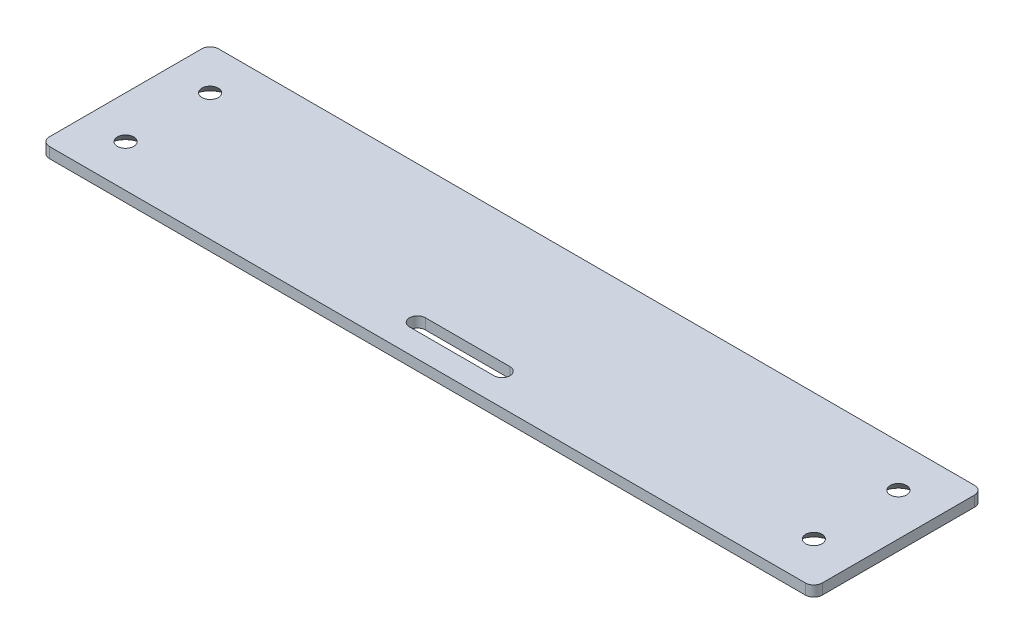
ISO-10303-21;
HEADER;
FILE_DESCRIPTION(('STEP AP214'),'2;1');
FILE_NAME('part.step','',(''),(''),'','','');
FILE_SCHEMA(('AUTOMOTIVE_DESIGN { 1 0 10303 214 1 1 1 1 }'));
ENDSEC;
DATA;
#1=APPLICATION_CONTEXT('core data for automotive mechanical design processes');
#2=APPLICATION_PROTOCOL_DEFINITION('international standard','automotive_design',2000,#1);
#3=PRODUCT_CONTEXT('',#1,'mechanical');
#4=PRODUCT('Part','Part','',(#3));
#5=PRODUCT_RELATED_PRODUCT_CATEGORY('part','',(#4));
#6=PRODUCT_DEFINITION_FORMATION('','',#4);
#7=PRODUCT_DEFINITION_CONTEXT('part definition',#1,'design');
#8=PRODUCT_DEFINITION('design','',#6,#7);
#9=PRODUCT_DEFINITION_SHAPE('','',#8);
#10=(LENGTH_UNIT() NAMED_UNIT(*) SI_UNIT(.MILLI.,.METRE.));
#11=(NAMED_UNIT(*) PLANE_ANGLE_UNIT() SI_UNIT($,.RADIAN.));
#12=(NAMED_UNIT(*) SI_UNIT($,.STERADIAN.) SOLID_ANGLE_UNIT());
#13=UNCERTAINTY_MEASURE_WITH_UNIT(LENGTH_MEASURE(1.E-05),#10,'distance_accuracy_value','');
#14=(GEOMETRIC_REPRESENTATION_CONTEXT(3) GLOBAL_UNCERTAINTY_ASSIGNED_CONTEXT((#13)) GLOBAL_UNIT_ASSIGNED_CONTEXT((#10,
#11,#12)) REPRESENTATION_CONTEXT('',''));
#15=CARTESIAN_POINT('',(0.,0.,0.));
#16=DIRECTION('',(0.,0.,1.));
#17=DIRECTION('',(1.,0.,0.));
#18=AXIS2_PLACEMENT_3D('',#15,#16,#17);
#19=CARTESIAN_POINT('',(-192.225528742822,0.,173.764846249872));
#20=DIRECTION('',(0.,1.,0.));
#21=DIRECTION('',(0.,0.,1.));
#22=AXIS2_PLACEMENT_3D('',#19,#20,#21);
#23=PLANE('',#22);
#24=DIRECTION('',(1.,0.,0.));
#25=VECTOR('',#24,1.);
#26=CARTESIAN_POINT('',(-91.2221287493033,0.,164.392246249872));
#27=LINE('',#26,#25);
#28=CARTESIAN_POINT('',(-91.2221287493033,0.,164.392246249872));
#29=VERTEX_POINT('',#28);
#30=CARTESIAN_POINT('',(-65.8221287493033,0.,164.392246249872));
#31=VERTEX_POINT('',#30);
#32=EDGE_CURVE('E169',#29,#31,#27,.T.);
#33=ORIENTED_EDGE('',*,*,#32,.F.);
#34=CARTESIAN_POINT('',(-91.2221287493033,0.,166.779846249872));
#35=DIRECTION('',(0.,-1.,0.));
#36=DIRECTION('',(0.,0.,-1.));
#37=AXIS2_PLACEMENT_3D('',#34,#35,#36);
#38=CIRCLE('',#37,2.38759999999999);
#39=CARTESIAN_POINT('',(-91.2221287493033,0.,169.167446249872));
#40=VERTEX_POINT('',#39);
#41=EDGE_CURVE('E61',#40,#29,#38,.T.);
#42=ORIENTED_EDGE('',*,*,#41,.F.);
#43=DIRECTION('',(-1.,0.,0.));
#44=VECTOR('',#43,1.);
#45=CARTESIAN_POINT('',(-65.8221287493033,0.,169.167446249872));
#46=LINE('',#45,#44);
#47=CARTESIAN_POINT('',(-65.8221287493033,0.,169.167446249872));
#48=VERTEX_POINT('',#47);
#49=EDGE_CURVE('E156',#48,#40,#46,.T.);
#50=ORIENTED_EDGE('',*,*,#49,.F.);
#51=CARTESIAN_POINT('',(-65.8221287493033,0.,166.779846249872));
#52=DIRECTION('',(0.,-1.,0.));
#53=DIRECTION('',(0.,0.,1.));
#54=AXIS2_PLACEMENT_3D('',#51,#52,#53);
#55=CIRCLE('',#54,2.38759999999999);
#56=EDGE_CURVE('E160',#31,#48,#55,.T.);
#57=ORIENTED_EDGE('',*,*,#56,.F.);
#58=EDGE_LOOP('',(#33,#42,#50,#57));
#59=FACE_BOUND('',#58,.T.);
#60=CARTESIAN_POINT('',(24.6653664444665,0.,163.604846249872));
#61=DIRECTION('',(0.,-1.,0.));
#62=DIRECTION('',(0.,0.,-1.));
#63=AXIS2_PLACEMENT_3D('',#60,#61,#62);
#64=CIRCLE('',#63,5.2197);
#65=CARTESIAN_POINT('',(24.6653664444665,0.,158.385146249872));
#66=VERTEX_POINT('',#65);
#67=EDGE_CURVE('E178',#66,#66,#64,.T.);
#68=ORIENTED_EDGE('',*,*,#67,.F.);
#69=EDGE_LOOP('',(#68));
#70=FACE_BOUND('',#69,.T.);
#71=CARTESIAN_POINT('',(-182.065528742822,0.,138.204846249872));
#72=DIRECTION('',(0.,-1.,0.));
#73=DIRECTION('',(0.,0.,-1.));
#74=AXIS2_PLACEMENT_3D('',#71,#72,#73);
#75=CIRCLE('',#74,5.21969999999999);
#76=CARTESIAN_POINT('',(-182.065528742822,0.,132.985146249872));
#77=VERTEX_POINT('',#76);
#78=EDGE_CURVE('E192',#77,#77,#75,.T.);
#79=ORIENTED_EDGE('',*,*,#78,.F.);
#80=EDGE_LOOP('',(#79));
#81=FACE_BOUND('',#80,.T.);
#82=CARTESIAN_POINT('',(-182.065528742822,0.,163.604846249872));
#83=DIRECTION('',(0.,-1.,0.));
#84=DIRECTION('',(0.,0.,-1.));
#85=AXIS2_PLACEMENT_3D('',#82,#83,#84);
#86=CIRCLE('',#85,5.21969999999999);
#87=CARTESIAN_POINT('',(-182.065528742822,0.,158.385146249872));
#88=VERTEX_POINT('',#87);
#89=EDGE_CURVE('E200',#88,#88,#86,.T.);
#90=ORIENTED_EDGE('',*,*,#89,.F.);
#91=EDGE_LOOP('',(#90));
#92=FACE_BOUND('',#91,.T.);
#93=CARTESIAN_POINT('',(-192.225528742822,0.,173.764846249872));
#94=DIRECTION('',(0.,1.,0.));
#95=DIRECTION('',(0.,0.,1.));
#96=AXIS2_PLACEMENT_3D('',#93,#94,#95);
#97=CIRCLE('',#96,2.54000000000001);
#98=CARTESIAN_POINT('',(-194.765528742822,0.,173.764846249872));
#99=VERTEX_POINT('',#98);
#100=CARTESIAN_POINT('',(-192.225528742822,0.,176.304846249872));
#101=VERTEX_POINT('',#100);
#102=EDGE_CURVE('E208',#99,#101,#97,.T.);
#103=ORIENTED_EDGE('',*,*,#102,.F.);
#104=DIRECTION('',(0.,0.,1.));
#105=VECTOR('',#104,1.);
#106=CARTESIAN_POINT('',(-194.765528742822,0.,128.044846249872));
#107=LINE('',#106,#105);
#108=CARTESIAN_POINT('',(-194.765528742822,0.,128.044846249872));
#109=VERTEX_POINT('',#108);
#110=EDGE_CURVE('E214',#109,#99,#107,.T.);
#111=ORIENTED_EDGE('',*,*,#110,.F.);
#112=CARTESIAN_POINT('',(-192.225528742822,0.,128.044846249872));
#113=DIRECTION('',(0.,1.,0.));
#114=DIRECTION('',(0.,0.,-1.));
#115=AXIS2_PLACEMENT_3D('',#112,#113,#114);
#116=CIRCLE('',#115,2.53999999999997);
#117=CARTESIAN_POINT('',(-192.225528742822,0.,125.504846249872));
#118=VERTEX_POINT('',#117);
#119=EDGE_CURVE('E254',#118,#109,#116,.T.);
#120=ORIENTED_EDGE('',*,*,#119,.F.);
#121=DIRECTION('',(-1.,0.,0.));
#122=VECTOR('',#121,1.);
#123=CARTESIAN_POINT('',(34.8253664444665,0.,125.504846249872));
#124=LINE('',#123,#122);
#125=CARTESIAN_POINT('',(34.8253664444665,0.,125.504846249872));
#126=VERTEX_POINT('',#125);
#127=EDGE_CURVE('E251',#126,#118,#124,.T.);
#128=ORIENTED_EDGE('',*,*,#127,.F.);
#129=CARTESIAN_POINT('',(34.8253664444665,0.,128.044846249872));
#130=DIRECTION('',(0.,1.,0.));
#131=DIRECTION('',(0.,0.,-1.));
#132=AXIS2_PLACEMENT_3D('',#129,#130,#131);
#133=CIRCLE('',#132,2.53999999999999);
#134=CARTESIAN_POINT('',(37.3653664444665,0.,128.044846249872));
#135=VERTEX_POINT('',#134);
#136=EDGE_CURVE('E248',#135,#126,#133,.T.);
#137=ORIENTED_EDGE('',*,*,#136,.F.);
#138=DIRECTION('',(0.,0.,-1.));
#139=VECTOR('',#138,1.);
#140=CARTESIAN_POINT('',(37.3653664444665,0.,173.764846249872));
#141=LINE('',#140,#139);
#142=CARTESIAN_POINT('',(37.3653664444665,0.,173.764846249872));
#143=VERTEX_POINT('',#142);
#144=EDGE_CURVE('E245',#143,#135,#141,.T.);
#145=ORIENTED_EDGE('',*,*,#144,.F.);
#146=CARTESIAN_POINT('',(34.8253664444665,0.,173.764846249872));
#147=DIRECTION('',(0.,1.,0.));
#148=DIRECTION('',(0.,0.,1.));
#149=AXIS2_PLACEMENT_3D('',#146,#147,#148);
#150=CIRCLE('',#149,2.53999999999999);
#151=CARTESIAN_POINT('',(34.8253664444665,0.,176.304846249872));
#152=VERTEX_POINT('',#151);
#153=EDGE_CURVE('E242',#152,#143,#150,.T.);
#154=ORIENTED_EDGE('',*,*,#153,.F.);
#155=DIRECTION('',(1.,0.,0.));
#156=VECTOR('',#155,1.);
#157=CARTESIAN_POINT('',(-192.225528742822,0.,176.304846249872));
#158=LINE('',#157,#156);
#159=EDGE_CURVE('E239',#101,#152,#158,.T.);
#160=ORIENTED_EDGE('',*,*,#159,.F.);
#161=EDGE_LOOP('',(#103,#111,#120,#128,#137,#145,#154,#160));
#162=FACE_BOUND('',#161,.T.);
#163=CARTESIAN_POINT('',(24.6653664444665,0.,138.204846249872));
#164=DIRECTION('',(0.,-1.,0.));
#165=DIRECTION('',(0.,0.,-1.));
#166=AXIS2_PLACEMENT_3D('',#163,#164,#165);
#167=CIRCLE('',#166,5.2197);
#168=CARTESIAN_POINT('',(24.6653664444665,0.,132.985146249872));
#169=VERTEX_POINT('',#168);
#170=EDGE_CURVE('E187',#169,#169,#167,.T.);
#171=ORIENTED_EDGE('',*,*,#170,.F.);
#172=EDGE_LOOP('',(#171));
#173=FACE_BOUND('',#172,.T.);
#174=ADVANCED_FACE('F43',(#59,#70,#81,#92,#162,#173),#23,.F.);
#175=CARTESIAN_POINT('',(-192.225528742822,3.175,173.764846249872));
#176=DIRECTION('',(0.,1.,0.));
#177=DIRECTION('',(0.,0.,1.));
#178=AXIS2_PLACEMENT_3D('',#175,#176,#177);
#179=PLANE('',#178);
#180=CARTESIAN_POINT('',(-91.2221287493033,3.175,166.779846249872));
#181=DIRECTION('',(0.,-1.,0.));
#182=DIRECTION('',(0.,0.,-1.));
#183=AXIS2_PLACEMENT_3D('',#180,#181,#182);
#184=CIRCLE('',#183,2.38759999999999);
#185=CARTESIAN_POINT('',(-91.2221287493033,3.175,169.167446249872));
#186=VERTEX_POINT('',#185);
#187=CARTESIAN_POINT('',(-91.2221287493033,3.175,164.392246249872));
#188=VERTEX_POINT('',#187);
#189=EDGE_CURVE('E137',#186,#188,#184,.T.);
#190=ORIENTED_EDGE('',*,*,#189,.T.);
#191=DIRECTION('',(1.,0.,0.));
#192=VECTOR('',#191,1.);
#193=CARTESIAN_POINT('',(-91.2221287493033,3.175,164.392246249872));
#194=LINE('',#193,#192);
#195=CARTESIAN_POINT('',(-65.8221287493033,3.175,164.392246249872));
#196=VERTEX_POINT('',#195);
#197=EDGE_CURVE('E147',#188,#196,#194,.T.);
#198=ORIENTED_EDGE('',*,*,#197,.T.);
#199=CARTESIAN_POINT('',(-65.8221287493033,3.175,166.779846249872));
#200=DIRECTION('',(0.,-1.,0.));
#201=DIRECTION('',(0.,0.,1.));
#202=AXIS2_PLACEMENT_3D('',#199,#200,#201);
#203=CIRCLE('',#202,2.38759999999999);
#204=CARTESIAN_POINT('',(-65.8221287493033,3.175,169.167446249872));
#205=VERTEX_POINT('',#204);
#206=EDGE_CURVE('E69',#196,#205,#203,.T.);
#207=ORIENTED_EDGE('',*,*,#206,.T.);
#208=DIRECTION('',(-1.,0.,0.));
#209=VECTOR('',#208,1.);
#210=CARTESIAN_POINT('',(-65.8221287493033,3.175,169.167446249872));
#211=LINE('',#210,#209);
#212=EDGE_CURVE('E144',#205,#186,#211,.T.);
#213=ORIENTED_EDGE('',*,*,#212,.T.);
#214=EDGE_LOOP('',(#190,#198,#207,#213));
#215=FACE_BOUND('',#214,.T.);
#216=CARTESIAN_POINT('',(24.6653664444665,3.175,163.604846249872));
#217=DIRECTION('',(0.,1.,0.));
#218=DIRECTION('',(0.,0.,1.));
#219=AXIS2_PLACEMENT_3D('',#216,#217,#218);
#220=CIRCLE('',#219,2.45971460743348);
#221=CARTESIAN_POINT('',(24.6653664444665,3.175,166.064560857305));
#222=VERTEX_POINT('',#221);
#223=EDGE_CURVE('E47',#222,#222,#220,.T.);
#224=ORIENTED_EDGE('',*,*,#223,.F.);
#225=EDGE_LOOP('',(#224));
#226=FACE_BOUND('',#225,.T.);
#227=CARTESIAN_POINT('',(24.6653664444665,3.175,138.204846249872));
#228=DIRECTION('',(0.,1.,0.));
#229=DIRECTION('',(0.,0.,1.));
#230=AXIS2_PLACEMENT_3D('',#227,#228,#229);
#231=CIRCLE('',#230,2.45971460743348);
#232=CARTESIAN_POINT('',(24.6653664444665,3.175,140.664560857305));
#233=VERTEX_POINT('',#232);
#234=EDGE_CURVE('E191',#233,#233,#231,.T.);
#235=ORIENTED_EDGE('',*,*,#234,.F.);
#236=EDGE_LOOP('',(#235));
#237=FACE_BOUND('',#236,.T.);
#238=CARTESIAN_POINT('',(-192.225528742822,3.175,173.764846249872));
#239=DIRECTION('',(0.,1.,0.));
#240=DIRECTION('',(0.,0.,1.));
#241=AXIS2_PLACEMENT_3D('',#238,#239,#240);
#242=CIRCLE('',#241,2.54000000000001);
#243=CARTESIAN_POINT('',(-194.765528742822,3.175,173.764846249872));
#244=VERTEX_POINT('',#243);
#245=CARTESIAN_POINT('',(-192.225528742822,3.175,176.304846249872));
#246=VERTEX_POINT('',#245);
#247=EDGE_CURVE('E209',#244,#246,#242,.T.);
#248=ORIENTED_EDGE('',*,*,#247,.T.);
#249=DIRECTION('',(1.,0.,0.));
#250=VECTOR('',#249,1.);
#251=CARTESIAN_POINT('',(-192.225528742822,3.175,176.304846249872));
#252=LINE('',#251,#250);
#253=CARTESIAN_POINT('',(34.8253664444665,3.175,176.304846249872));
#254=VERTEX_POINT('',#253);
#255=EDGE_CURVE('E213',#246,#254,#252,.T.);
#256=ORIENTED_EDGE('',*,*,#255,.T.);
#257=CARTESIAN_POINT('',(34.8253664444665,3.175,173.764846249872));
#258=DIRECTION('',(0.,1.,0.));
#259=DIRECTION('',(0.,0.,1.));
#260=AXIS2_PLACEMENT_3D('',#257,#258,#259);
#261=CIRCLE('',#260,2.53999999999999);
#262=CARTESIAN_POINT('',(37.3653664444665,3.175,173.764846249872));
#263=VERTEX_POINT('',#262);
#264=EDGE_CURVE('E217',#254,#263,#261,.T.);
#265=ORIENTED_EDGE('',*,*,#264,.T.);
#266=DIRECTION('',(0.,0.,-1.));
#267=VECTOR('',#266,1.);
#268=CARTESIAN_POINT('',(37.3653664444665,3.175,173.764846249872));
#269=LINE('',#268,#267);
#270=CARTESIAN_POINT('',(37.3653664444665,3.175,128.044846249872));
#271=VERTEX_POINT('',#270);
#272=EDGE_CURVE('E220',#263,#271,#269,.T.);
#273=ORIENTED_EDGE('',*,*,#272,.T.);
#274=CARTESIAN_POINT('',(34.8253664444665,3.175,128.044846249872));
#275=DIRECTION('',(0.,1.,0.));
#276=DIRECTION('',(0.,0.,-1.));
#277=AXIS2_PLACEMENT_3D('',#274,#275,#276);
#278=CIRCLE('',#277,2.53999999999999);
#279=CARTESIAN_POINT('',(34.8253664444665,3.175,125.504846249872));
#280=VERTEX_POINT('',#279);
#281=EDGE_CURVE('E223',#271,#280,#278,.T.);
#282=ORIENTED_EDGE('',*,*,#281,.T.);
#283=DIRECTION('',(-1.,0.,0.));
#284=VECTOR('',#283,1.);
#285=CARTESIAN_POINT('',(34.8253664444665,3.175,125.504846249872));
#286=LINE('',#285,#284);
#287=CARTESIAN_POINT('',(-192.225528742822,3.175,125.504846249872));
#288=VERTEX_POINT('',#287);
#289=EDGE_CURVE('E226',#280,#288,#286,.T.);
#290=ORIENTED_EDGE('',*,*,#289,.T.);
#291=CARTESIAN_POINT('',(-192.225528742822,3.175,128.044846249872));
#292=DIRECTION('',(0.,1.,0.));
#293=DIRECTION('',(0.,0.,-1.));
#294=AXIS2_PLACEMENT_3D('',#291,#292,#293);
#295=CIRCLE('',#294,2.53999999999997);
#296=CARTESIAN_POINT('',(-194.765528742822,3.175,128.044846249872));
#297=VERTEX_POINT('',#296);
#298=EDGE_CURVE('E229',#288,#297,#295,.T.);
#299=ORIENTED_EDGE('',*,*,#298,.T.);
#300=DIRECTION('',(0.,0.,1.));
#301=VECTOR('',#300,1.);
#302=CARTESIAN_POINT('',(-194.765528742822,3.175,128.044846249872));
#303=LINE('',#302,#301);
#304=EDGE_CURVE('E232',#297,#244,#303,.T.);
#305=ORIENTED_EDGE('',*,*,#304,.T.);
#306=EDGE_LOOP('',(#248,#256,#265,#273,#282,#290,#299,#305));
#307=FACE_BOUND('',#306,.T.);
#308=CARTESIAN_POINT('',(-182.065528742822,3.175,163.604846249872));
#309=DIRECTION('',(0.,1.,0.));
#310=DIRECTION('',(0.,0.,1.));
#311=AXIS2_PLACEMENT_3D('',#308,#309,#310);
#312=CIRCLE('',#311,2.45971460743348);
#313=CARTESIAN_POINT('',(-182.065528742822,3.175,166.064560857305));
#314=VERTEX_POINT('',#313);
#315=EDGE_CURVE('E204',#314,#314,#312,.T.);
#316=ORIENTED_EDGE('',*,*,#315,.F.);
#317=EDGE_LOOP('',(#316));
#318=FACE_BOUND('',#317,.T.);
#319=CARTESIAN_POINT('',(-182.065528742822,3.175,138.204846249872));
#320=DIRECTION('',(0.,1.,0.));
#321=DIRECTION('',(0.,0.,1.));
#322=AXIS2_PLACEMENT_3D('',#319,#320,#321);
#323=CIRCLE('',#322,2.45971460743348);
#324=CARTESIAN_POINT('',(-182.065528742822,3.175,140.664560857305));
#325=VERTEX_POINT('',#324);
#326=EDGE_CURVE('E196',#325,#325,#323,.T.);
#327=ORIENTED_EDGE('',*,*,#326,.F.);
#328=EDGE_LOOP('',(#327));
#329=FACE_BOUND('',#328,.T.);
#330=ADVANCED_FACE('F152',(#215,#226,#237,#307,#318,#329),#179,.T.);
#331=CARTESIAN_POINT('',(-192.225528742822,3.175,173.764846249872));
#332=DIRECTION('',(0.,-1.,0.));
#333=DIRECTION('',(0.,0.,-1.));
#334=AXIS2_PLACEMENT_3D('',#331,#332,#333);
#335=CYLINDRICAL_SURFACE('',#334,2.54000000000001);
#336=ORIENTED_EDGE('',*,*,#102,.T.);
#337=DIRECTION('',(0.,-1.,0.));
#338=VECTOR('',#337,1.);
#339=CARTESIAN_POINT('',(-192.225528742822,3.175,176.304846249872));
#340=LINE('',#339,#338);
#341=EDGE_CURVE('E11',#246,#101,#340,.T.);
#342=ORIENTED_EDGE('',*,*,#341,.F.);
#343=ORIENTED_EDGE('',*,*,#247,.F.);
#344=DIRECTION('',(0.,-1.,0.));
#345=VECTOR('',#344,1.);
#346=CARTESIAN_POINT('',(-194.765528742822,3.175,173.764846249872));
#347=LINE('',#346,#345);
#348=EDGE_CURVE('E235',#244,#99,#347,.T.);
#349=ORIENTED_EDGE('',*,*,#348,.T.);
#350=EDGE_LOOP('',(#336,#342,#343,#349));
#351=FACE_BOUND('',#350,.T.);
#352=ADVANCED_FACE('F45',(#351),#335,.T.);
#353=CARTESIAN_POINT('',(-192.225528742822,3.175,176.304846249872));
#354=DIRECTION('',(0.,0.,-1.));
#355=DIRECTION('',(-1.,0.,0.));
#356=AXIS2_PLACEMENT_3D('',#353,#354,#355);
#357=PLANE('',#356);
#358=ORIENTED_EDGE('',*,*,#159,.T.);
#359=DIRECTION('',(0.,-1.,0.));
#360=VECTOR('',#359,1.);
#361=CARTESIAN_POINT('',(34.8253664444665,3.175,176.304846249872));
#362=LINE('',#361,#360);
#363=EDGE_CURVE('E53',#254,#152,#362,.T.);
#364=ORIENTED_EDGE('',*,*,#363,.F.);
#365=ORIENTED_EDGE('',*,*,#255,.F.);
#366=ORIENTED_EDGE('',*,*,#341,.T.);
#367=EDGE_LOOP('',(#358,#364,#365,#366));
#368=FACE_BOUND('',#367,.T.);
#369=ADVANCED_FACE('F353',(#368),#357,.F.);
#370=CARTESIAN_POINT('',(34.8253664444665,3.175,173.764846249872));
#371=DIRECTION('',(0.,-1.,0.));
#372=DIRECTION('',(0.,0.,-1.));
#373=AXIS2_PLACEMENT_3D('',#370,#371,#372);
#374=CYLINDRICAL_SURFACE('',#373,2.53999999999999);
#375=ORIENTED_EDGE('',*,*,#153,.T.);
#376=DIRECTION('',(0.,-1.,0.));
#377=VECTOR('',#376,1.);
#378=CARTESIAN_POINT('',(37.3653664444665,3.175,173.764846249872));
#379=LINE('',#378,#377);
#380=EDGE_CURVE('E278',#263,#143,#379,.T.);
#381=ORIENTED_EDGE('',*,*,#380,.F.);
#382=ORIENTED_EDGE('',*,*,#264,.F.);
#383=ORIENTED_EDGE('',*,*,#363,.T.);
#384=EDGE_LOOP('',(#375,#381,#382,#383));
#385=FACE_BOUND('',#384,.T.);
#386=ADVANCED_FACE('F350',(#385),#374,.T.);
#387=CARTESIAN_POINT('',(37.3653664444665,3.175,173.764846249872));
#388=DIRECTION('',(-1.,0.,0.));
#389=DIRECTION('',(0.,0.,1.));
#390=AXIS2_PLACEMENT_3D('',#387,#388,#389);
#391=PLANE('',#390);
#392=ORIENTED_EDGE('',*,*,#144,.T.);
#393=DIRECTION('',(0.,-1.,0.));
#394=VECTOR('',#393,1.);
#395=CARTESIAN_POINT('',(37.3653664444665,3.175,128.044846249872));
#396=LINE('',#395,#394);
#397=EDGE_CURVE('E274',#271,#135,#396,.T.);
#398=ORIENTED_EDGE('',*,*,#397,.F.);
#399=ORIENTED_EDGE('',*,*,#272,.F.);
#400=ORIENTED_EDGE('',*,*,#380,.T.);
#401=EDGE_LOOP('',(#392,#398,#399,#400));
#402=FACE_BOUND('',#401,.T.);
#403=ADVANCED_FACE('F346',(#402),#391,.F.);
#404=CARTESIAN_POINT('',(34.8253664444665,3.175,128.044846249872));
#405=DIRECTION('',(0.,-1.,0.));
#406=DIRECTION('',(0.,0.,-1.));
#407=AXIS2_PLACEMENT_3D('',#404,#405,#406);
#408=CYLINDRICAL_SURFACE('',#407,2.53999999999999);
#409=ORIENTED_EDGE('',*,*,#136,.T.);
#410=DIRECTION('',(0.,-1.,0.));
#411=VECTOR('',#410,1.);
#412=CARTESIAN_POINT('',(34.8253664444665,3.175,125.504846249872));
#413=LINE('',#412,#411);
#414=EDGE_CURVE('E270',#280,#126,#413,.T.);
#415=ORIENTED_EDGE('',*,*,#414,.F.);
#416=ORIENTED_EDGE('',*,*,#281,.F.);
#417=ORIENTED_EDGE('',*,*,#397,.T.);
#418=EDGE_LOOP('',(#409,#415,#416,#417));
#419=FACE_BOUND('',#418,.T.);
#420=ADVANCED_FACE('F342',(#419),#408,.T.);
#421=CARTESIAN_POINT('',(34.8253664444665,3.175,125.504846249872));
#422=DIRECTION('',(0.,0.,1.));
#423=DIRECTION('',(1.,0.,0.));
#424=AXIS2_PLACEMENT_3D('',#421,#422,#423);
#425=PLANE('',#424);
#426=ORIENTED_EDGE('',*,*,#127,.T.);
#427=DIRECTION('',(0.,-1.,0.));
#428=VECTOR('',#427,1.);
#429=CARTESIAN_POINT('',(-192.225528742822,3.175,125.504846249872));
#430=LINE('',#429,#428);
#431=EDGE_CURVE('E266',#288,#118,#430,.T.);
#432=ORIENTED_EDGE('',*,*,#431,.F.);
#433=ORIENTED_EDGE('',*,*,#289,.F.);
#434=ORIENTED_EDGE('',*,*,#414,.T.);
#435=EDGE_LOOP('',(#426,#432,#433,#434));
#436=FACE_BOUND('',#435,.T.);
#437=ADVANCED_FACE('F338',(#436),#425,.F.);
#438=CARTESIAN_POINT('',(-192.225528742822,3.175,128.044846249872));
#439=DIRECTION('',(0.,-1.,0.));
#440=DIRECTION('',(0.,0.,-1.));
#441=AXIS2_PLACEMENT_3D('',#438,#439,#440);
#442=CYLINDRICAL_SURFACE('',#441,2.53999999999997);
#443=ORIENTED_EDGE('',*,*,#119,.T.);
#444=DIRECTION('',(0.,-1.,0.));
#445=VECTOR('',#444,1.);
#446=CARTESIAN_POINT('',(-194.765528742822,3.175,128.044846249872));
#447=LINE('',#446,#445);
#448=EDGE_CURVE('E262',#297,#109,#447,.T.);
#449=ORIENTED_EDGE('',*,*,#448,.F.);
#450=ORIENTED_EDGE('',*,*,#298,.F.);
#451=ORIENTED_EDGE('',*,*,#431,.T.);
#452=EDGE_LOOP('',(#443,#449,#450,#451));
#453=FACE_BOUND('',#452,.T.);
#454=ADVANCED_FACE('F334',(#453),#442,.T.);
#455=CARTESIAN_POINT('',(-194.765528742822,3.175,128.044846249872));
#456=DIRECTION('',(1.,0.,0.));
#457=DIRECTION('',(0.,0.,-1.));
#458=AXIS2_PLACEMENT_3D('',#455,#456,#457);
#459=PLANE('',#458);
#460=ORIENTED_EDGE('',*,*,#110,.T.);
#461=ORIENTED_EDGE('',*,*,#348,.F.);
#462=ORIENTED_EDGE('',*,*,#304,.F.);
#463=ORIENTED_EDGE('',*,*,#448,.T.);
#464=EDGE_LOOP('',(#460,#461,#462,#463));
#465=FACE_BOUND('',#464,.T.);
#466=ADVANCED_FACE('F329',(#465),#459,.F.);
#467=CARTESIAN_POINT('',(-182.065528742822,0.,163.604846249872));
#468=DIRECTION('',(0.,-1.,0.));
#469=DIRECTION('',(0.,0.,-1.));
#470=AXIS2_PLACEMENT_3D('',#467,#468,#469);
#471=CONICAL_SURFACE('',#470,5.21969999999999,0.715584993317674);
#472=ORIENTED_EDGE('',*,*,#315,.T.);
#473=EDGE_LOOP('',(#472));
#474=FACE_BOUND('',#473,.T.);
#475=ORIENTED_EDGE('',*,*,#89,.T.);
#476=EDGE_LOOP('',(#475));
#477=FACE_BOUND('',#476,.T.);
#478=ADVANCED_FACE('F304',(#474,#477),#471,.F.);
#479=CARTESIAN_POINT('',(-182.065528742822,0.,138.204846249872));
#480=DIRECTION('',(0.,-1.,0.));
#481=DIRECTION('',(0.,0.,-1.));
#482=AXIS2_PLACEMENT_3D('',#479,#480,#481);
#483=CONICAL_SURFACE('',#482,5.21969999999999,0.715584993317674);
#484=ORIENTED_EDGE('',*,*,#326,.T.);
#485=EDGE_LOOP('',(#484));
#486=FACE_BOUND('',#485,.T.);
#487=ORIENTED_EDGE('',*,*,#78,.T.);
#488=EDGE_LOOP('',(#487));
#489=FACE_BOUND('',#488,.T.);
#490=ADVANCED_FACE('F301',(#486,#489),#483,.F.);
#491=CARTESIAN_POINT('',(24.6653664444665,0.,138.204846249872));
#492=DIRECTION('',(0.,-1.,0.));
#493=DIRECTION('',(0.,0.,-1.));
#494=AXIS2_PLACEMENT_3D('',#491,#492,#493);
#495=CONICAL_SURFACE('',#494,5.2197,0.715584993317675);
#496=ORIENTED_EDGE('',*,*,#234,.T.);
#497=EDGE_LOOP('',(#496));
#498=FACE_BOUND('',#497,.T.);
#499=ORIENTED_EDGE('',*,*,#170,.T.);
#500=EDGE_LOOP('',(#499));
#501=FACE_BOUND('',#500,.T.);
#502=ADVANCED_FACE('F288',(#498,#501),#495,.F.);
#503=CARTESIAN_POINT('',(24.6653664444665,0.,163.604846249872));
#504=DIRECTION('',(0.,-1.,0.));
#505=DIRECTION('',(0.,0.,-1.));
#506=AXIS2_PLACEMENT_3D('',#503,#504,#505);
#507=CONICAL_SURFACE('',#506,5.2197,0.715584993317675);
#508=ORIENTED_EDGE('',*,*,#223,.T.);
#509=EDGE_LOOP('',(#508));
#510=FACE_BOUND('',#509,.T.);
#511=ORIENTED_EDGE('',*,*,#67,.T.);
#512=EDGE_LOOP('',(#511));
#513=FACE_BOUND('',#512,.T.);
#514=ADVANCED_FACE('F319',(#510,#513),#507,.F.);
#515=CARTESIAN_POINT('',(-91.2221287493033,3.175,166.779846249872));
#516=DIRECTION('',(0.,-1.,0.));
#517=DIRECTION('',(0.,0.,-1.));
#518=AXIS2_PLACEMENT_3D('',#515,#516,#517);
#519=CYLINDRICAL_SURFACE('',#518,2.38759999999999);
#520=ORIENTED_EDGE('',*,*,#41,.T.);
#521=DIRECTION('',(0.,-1.,0.));
#522=VECTOR('',#521,1.);
#523=CARTESIAN_POINT('',(-91.2221287493033,3.175,164.392246249872));
#524=LINE('',#523,#522);
#525=EDGE_CURVE('E133',#188,#29,#524,.T.);
#526=ORIENTED_EDGE('',*,*,#525,.F.);
#527=ORIENTED_EDGE('',*,*,#189,.F.);
#528=DIRECTION('',(0.,-1.,0.));
#529=VECTOR('',#528,1.);
#530=CARTESIAN_POINT('',(-91.2221287493033,3.175,169.167446249872));
#531=LINE('',#530,#529);
#532=EDGE_CURVE('E175',#186,#40,#531,.T.);
#533=ORIENTED_EDGE('',*,*,#532,.T.);
#534=EDGE_LOOP('',(#520,#526,#527,#533));
#535=FACE_BOUND('',#534,.T.);
#536=ADVANCED_FACE('F135',(#535),#519,.F.);
#537=CARTESIAN_POINT('',(-65.8221287493033,3.175,169.167446249872));
#538=DIRECTION('',(0.,0.,1.));
#539=DIRECTION('',(1.,0.,0.));
#540=AXIS2_PLACEMENT_3D('',#537,#538,#539);
#541=PLANE('',#540);
#542=ORIENTED_EDGE('',*,*,#49,.T.);
#543=ORIENTED_EDGE('',*,*,#532,.F.);
#544=ORIENTED_EDGE('',*,*,#212,.F.);
#545=DIRECTION('',(0.,-1.,0.));
#546=VECTOR('',#545,1.);
#547=CARTESIAN_POINT('',(-65.8221287493033,3.175,169.167446249872));
#548=LINE('',#547,#546);
#549=EDGE_CURVE('E179',#205,#48,#548,.T.);
#550=ORIENTED_EDGE('',*,*,#549,.T.);
#551=EDGE_LOOP('',(#542,#543,#544,#550));
#552=FACE_BOUND('',#551,.T.);
#553=ADVANCED_FACE('F493',(#552),#541,.F.);
#554=CARTESIAN_POINT('',(-65.8221287493033,3.175,166.779846249872));
#555=DIRECTION('',(0.,-1.,0.));
#556=DIRECTION('',(0.,0.,-1.));
#557=AXIS2_PLACEMENT_3D('',#554,#555,#556);
#558=CYLINDRICAL_SURFACE('',#557,2.38759999999999);
#559=ORIENTED_EDGE('',*,*,#56,.T.);
#560=ORIENTED_EDGE('',*,*,#549,.F.);
#561=ORIENTED_EDGE('',*,*,#206,.F.);
#562=DIRECTION('',(0.,-1.,0.));
#563=VECTOR('',#562,1.);
#564=CARTESIAN_POINT('',(-65.8221287493033,3.175,164.392246249872));
#565=LINE('',#564,#563);
#566=EDGE_CURVE('E143',#196,#31,#565,.T.);
#567=ORIENTED_EDGE('',*,*,#566,.T.);
#568=EDGE_LOOP('',(#559,#560,#561,#567));
#569=FACE_BOUND('',#568,.T.);
#570=ADVANCED_FACE('F500',(#569),#558,.F.);
#571=CARTESIAN_POINT('',(-91.2221287493033,3.175,164.392246249872));
#572=DIRECTION('',(0.,0.,-1.));
#573=DIRECTION('',(-1.,0.,0.));
#574=AXIS2_PLACEMENT_3D('',#571,#572,#573);
#575=PLANE('',#574);
#576=ORIENTED_EDGE('',*,*,#32,.T.);
#577=ORIENTED_EDGE('',*,*,#566,.F.);
#578=ORIENTED_EDGE('',*,*,#197,.F.);
#579=ORIENTED_EDGE('',*,*,#525,.T.);
#580=EDGE_LOOP('',(#576,#577,#578,#579));
#581=FACE_BOUND('',#580,.T.);
#582=ADVANCED_FACE('F148',(#581),#575,.F.);
#583=CLOSED_SHELL('',(#174,#330,#352,#369,#386,#403,#420,#437,#454,#466,#478,#490,#502,#514,
#536,#553,#570,#582));
#584=MANIFOLD_SOLID_BREP('B2',#583);
#585=ADVANCED_BREP_SHAPE_REPRESENTATION('',(#18,#584),#14);
#586=SHAPE_DEFINITION_REPRESENTATION(#9,#585);
ENDSEC;
END-ISO-10303-21;
